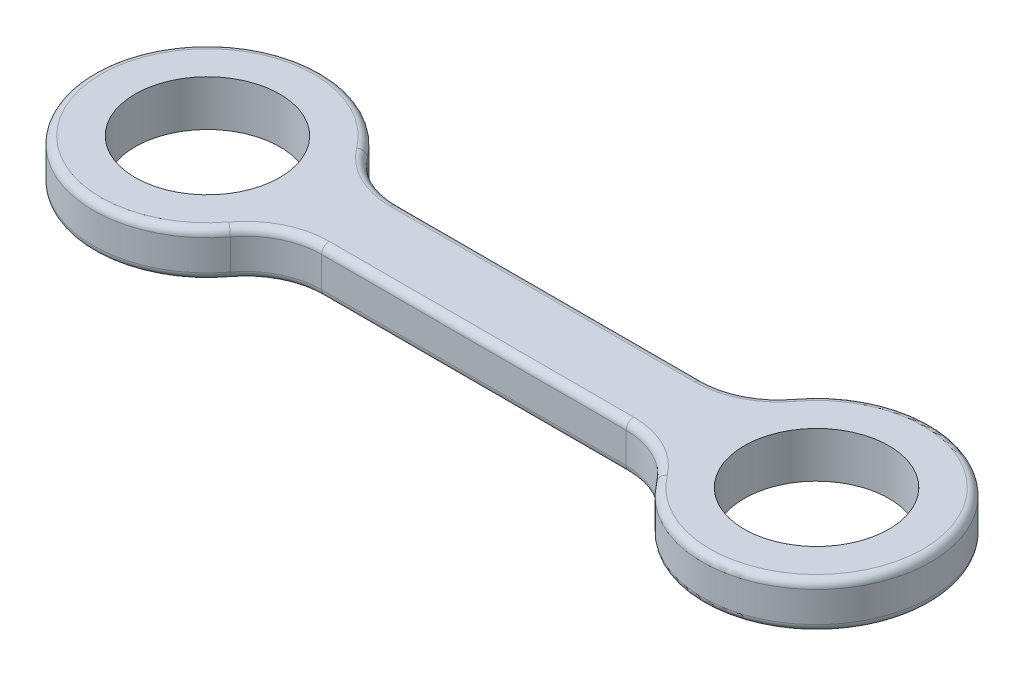
ISO-10303-21;
HEADER;
FILE_DESCRIPTION(('STEP AP214'),'2;1');
FILE_NAME('part.step','',(''),(''),'','','');
FILE_SCHEMA(('AUTOMOTIVE_DESIGN { 1 0 10303 214 1 1 1 1 }'));
ENDSEC;
DATA;
#1=APPLICATION_CONTEXT('core data for automotive mechanical design processes');
#2=APPLICATION_PROTOCOL_DEFINITION('international standard','automotive_design',2000,#1);
#3=PRODUCT_CONTEXT('',#1,'mechanical');
#4=PRODUCT('Part','Part','',(#3));
#5=PRODUCT_RELATED_PRODUCT_CATEGORY('part','',(#4));
#6=PRODUCT_DEFINITION_FORMATION('','',#4);
#7=PRODUCT_DEFINITION_CONTEXT('part definition',#1,'design');
#8=PRODUCT_DEFINITION('design','',#6,#7);
#9=PRODUCT_DEFINITION_SHAPE('','',#8);
#10=(LENGTH_UNIT() NAMED_UNIT(*) SI_UNIT(.MILLI.,.METRE.));
#11=(NAMED_UNIT(*) PLANE_ANGLE_UNIT() SI_UNIT($,.RADIAN.));
#12=(NAMED_UNIT(*) SI_UNIT($,.STERADIAN.) SOLID_ANGLE_UNIT());
#13=UNCERTAINTY_MEASURE_WITH_UNIT(LENGTH_MEASURE(1.E-05),#10,'distance_accuracy_value','');
#14=(GEOMETRIC_REPRESENTATION_CONTEXT(3) GLOBAL_UNCERTAINTY_ASSIGNED_CONTEXT((#13)) GLOBAL_UNIT_ASSIGNED_CONTEXT((#10,
#11,#12)) REPRESENTATION_CONTEXT('',''));
#15=CARTESIAN_POINT('',(0.,0.,0.));
#16=DIRECTION('',(0.,0.,1.));
#17=DIRECTION('',(1.,0.,0.));
#18=AXIS2_PLACEMENT_3D('',#15,#16,#17);
#19=CARTESIAN_POINT('',(11.9540229885058,6.,-15.));
#20=DIRECTION('',(0.,-1.,0.));
#21=DIRECTION('',(0.,0.,-1.));
#22=AXIS2_PLACEMENT_3D('',#19,#20,#21);
#23=PLANE('',#22);
#24=CARTESIAN_POINT('',(-48.0459770114942,6.,0.));
#25=DIRECTION('',(0.,-1.,0.));
#26=DIRECTION('',(0.,0.,-1.));
#27=AXIS2_PLACEMENT_3D('',#24,#25,#26);
#28=CIRCLE('',#27,14.);
#29=CARTESIAN_POINT('',(-36.8459770114942,6.,-8.4));
#30=VERTEX_POINT('',#29);
#31=CARTESIAN_POINT('',(-36.8459770114942,6.,8.4));
#32=VERTEX_POINT('',#31);
#33=EDGE_CURVE('E57',#30,#32,#28,.F.);
#34=ORIENTED_EDGE('',*,*,#33,.T.);
#35=CARTESIAN_POINT('',(-28.0459770114942,6.,15.));
#36=DIRECTION('',(0.,-1.,0.));
#37=DIRECTION('',(0.,0.,-1.));
#38=AXIS2_PLACEMENT_3D('',#35,#36,#37);
#39=CIRCLE('',#38,11.);
#40=CARTESIAN_POINT('',(-28.0459770114942,6.,4.));
#41=VERTEX_POINT('',#40);
#42=EDGE_CURVE('E159',#32,#41,#39,.T.);
#43=ORIENTED_EDGE('',*,*,#42,.T.);
#44=DIRECTION('',(1.,0.,0.));
#45=VECTOR('',#44,1.);
#46=CARTESIAN_POINT('',(11.9540229885058,6.,4.));
#47=LINE('',#46,#45);
#48=CARTESIAN_POINT('',(11.9540229885058,6.,4.));
#49=VERTEX_POINT('',#48);
#50=EDGE_CURVE('E267',#41,#49,#47,.T.);
#51=ORIENTED_EDGE('',*,*,#50,.T.);
#52=CARTESIAN_POINT('',(11.9540229885058,6.,15.));
#53=DIRECTION('',(0.,-1.,0.));
#54=DIRECTION('',(0.,0.,-1.));
#55=AXIS2_PLACEMENT_3D('',#52,#53,#54);
#56=CIRCLE('',#55,11.);
#57=CARTESIAN_POINT('',(20.7540229885058,6.,8.4));
#58=VERTEX_POINT('',#57);
#59=EDGE_CURVE('E270',#49,#58,#56,.T.);
#60=ORIENTED_EDGE('',*,*,#59,.T.);
#61=CARTESIAN_POINT('',(31.9540229885058,6.,0.));
#62=DIRECTION('',(0.,-1.,0.));
#63=DIRECTION('',(0.,0.,-1.));
#64=AXIS2_PLACEMENT_3D('',#61,#62,#63);
#65=CIRCLE('',#64,14.);
#66=CARTESIAN_POINT('',(20.7540229885058,6.,-8.4));
#67=VERTEX_POINT('',#66);
#68=EDGE_CURVE('E273',#58,#67,#65,.F.);
#69=ORIENTED_EDGE('',*,*,#68,.T.);
#70=CARTESIAN_POINT('',(11.9540229885058,6.,-15.));
#71=DIRECTION('',(0.,-1.,0.));
#72=DIRECTION('',(0.,0.,-1.));
#73=AXIS2_PLACEMENT_3D('',#70,#71,#72);
#74=CIRCLE('',#73,11.);
#75=CARTESIAN_POINT('',(11.9540229885058,6.,-4.));
#76=VERTEX_POINT('',#75);
#77=EDGE_CURVE('E276',#67,#76,#74,.T.);
#78=ORIENTED_EDGE('',*,*,#77,.T.);
#79=DIRECTION('',(-1.,0.,0.));
#80=VECTOR('',#79,1.);
#81=CARTESIAN_POINT('',(11.9540229885058,6.,-4.));
#82=LINE('',#81,#80);
#83=CARTESIAN_POINT('',(-28.0459770114942,6.,-4.));
#84=VERTEX_POINT('',#83);
#85=EDGE_CURVE('E279',#76,#84,#82,.T.);
#86=ORIENTED_EDGE('',*,*,#85,.T.);
#87=CARTESIAN_POINT('',(-28.0459770114942,6.,-15.));
#88=DIRECTION('',(0.,-1.,0.));
#89=DIRECTION('',(0.,0.,-1.));
#90=AXIS2_PLACEMENT_3D('',#87,#88,#89);
#91=CIRCLE('',#90,11.);
#92=EDGE_CURVE('E62',#84,#30,#91,.T.);
#93=ORIENTED_EDGE('',*,*,#92,.T.);
#94=EDGE_LOOP('',(#34,#43,#51,#60,#69,#78,#86,#93));
#95=FACE_BOUND('',#94,.T.);
#96=CARTESIAN_POINT('',(-48.0459770114942,6.,0.));
#97=DIRECTION('',(0.,1.,0.));
#98=DIRECTION('',(0.,0.,1.));
#99=AXIS2_PLACEMENT_3D('',#96,#97,#98);
#100=CIRCLE('',#99,9.5);
#101=CARTESIAN_POINT('',(-48.0459770114942,6.,9.5));
#102=VERTEX_POINT('',#101);
#103=EDGE_CURVE('E367',#102,#102,#100,.T.);
#104=ORIENTED_EDGE('',*,*,#103,.F.);
#105=EDGE_LOOP('',(#104));
#106=FACE_BOUND('',#105,.T.);
#107=CARTESIAN_POINT('',(31.9540229885058,6.,0.));
#108=DIRECTION('',(0.,1.,0.));
#109=DIRECTION('',(0.,0.,1.));
#110=AXIS2_PLACEMENT_3D('',#107,#108,#109);
#111=CIRCLE('',#110,9.50000000000001);
#112=CARTESIAN_POINT('',(31.9540229885058,6.,9.50000000000001));
#113=VERTEX_POINT('',#112);
#114=EDGE_CURVE('E443',#113,#113,#111,.T.);
#115=ORIENTED_EDGE('',*,*,#114,.F.);
#116=EDGE_LOOP('',(#115));
#117=FACE_BOUND('',#116,.T.);
#118=ADVANCED_FACE('F39',(#95,#106,#117),#23,.F.);
#119=CARTESIAN_POINT('',(11.9540229885058,0.,-15.));
#120=DIRECTION('',(0.,-1.,0.));
#121=DIRECTION('',(0.,0.,-1.));
#122=AXIS2_PLACEMENT_3D('',#119,#120,#121);
#123=PLANE('',#122);
#124=CARTESIAN_POINT('',(-28.0459770114942,0.,15.));
#125=DIRECTION('',(0.,-1.,0.));
#126=DIRECTION('',(0.,0.,-1.));
#127=AXIS2_PLACEMENT_3D('',#124,#125,#126);
#128=CIRCLE('',#127,11.);
#129=CARTESIAN_POINT('',(-28.0459770114942,0.,4.));
#130=VERTEX_POINT('',#129);
#131=CARTESIAN_POINT('',(-36.8459770114942,0.,8.4));
#132=VERTEX_POINT('',#131);
#133=EDGE_CURVE('E206',#130,#132,#128,.F.);
#134=ORIENTED_EDGE('',*,*,#133,.T.);
#135=CARTESIAN_POINT('',(-48.0459770114942,0.,0.));
#136=DIRECTION('',(0.,-1.,0.));
#137=DIRECTION('',(0.,0.,-1.));
#138=AXIS2_PLACEMENT_3D('',#135,#136,#137);
#139=CIRCLE('',#138,14.);
#140=CARTESIAN_POINT('',(-36.8459770114942,0.,-8.39999999999999));
#141=VERTEX_POINT('',#140);
#142=EDGE_CURVE('E227',#132,#141,#139,.T.);
#143=ORIENTED_EDGE('',*,*,#142,.T.);
#144=CARTESIAN_POINT('',(-28.0459770114942,0.,-15.));
#145=DIRECTION('',(0.,-1.,0.));
#146=DIRECTION('',(0.,0.,-1.));
#147=AXIS2_PLACEMENT_3D('',#144,#145,#146);
#148=CIRCLE('',#147,11.);
#149=CARTESIAN_POINT('',(-28.0459770114942,0.,-4.));
#150=VERTEX_POINT('',#149);
#151=EDGE_CURVE('E224',#141,#150,#148,.F.);
#152=ORIENTED_EDGE('',*,*,#151,.T.);
#153=DIRECTION('',(-1.,0.,0.));
#154=VECTOR('',#153,1.);
#155=CARTESIAN_POINT('',(11.9540229885058,0.,-4.));
#156=LINE('',#155,#154);
#157=CARTESIAN_POINT('',(11.9540229885058,0.,-4.));
#158=VERTEX_POINT('',#157);
#159=EDGE_CURVE('E221',#150,#158,#156,.F.);
#160=ORIENTED_EDGE('',*,*,#159,.T.);
#161=CARTESIAN_POINT('',(11.9540229885058,0.,-15.));
#162=DIRECTION('',(0.,-1.,0.));
#163=DIRECTION('',(0.,0.,-1.));
#164=AXIS2_PLACEMENT_3D('',#161,#162,#163);
#165=CIRCLE('',#164,11.);
#166=CARTESIAN_POINT('',(20.7540229885058,0.,-8.4));
#167=VERTEX_POINT('',#166);
#168=EDGE_CURVE('E218',#158,#167,#165,.F.);
#169=ORIENTED_EDGE('',*,*,#168,.T.);
#170=CARTESIAN_POINT('',(31.9540229885058,0.,0.));
#171=DIRECTION('',(0.,-1.,0.));
#172=DIRECTION('',(0.,0.,-1.));
#173=AXIS2_PLACEMENT_3D('',#170,#171,#172);
#174=CIRCLE('',#173,14.);
#175=CARTESIAN_POINT('',(20.7540229885058,0.,8.4));
#176=VERTEX_POINT('',#175);
#177=EDGE_CURVE('E215',#167,#176,#174,.T.);
#178=ORIENTED_EDGE('',*,*,#177,.T.);
#179=CARTESIAN_POINT('',(11.9540229885058,0.,15.));
#180=DIRECTION('',(0.,-1.,0.));
#181=DIRECTION('',(0.,0.,-1.));
#182=AXIS2_PLACEMENT_3D('',#179,#180,#181);
#183=CIRCLE('',#182,11.);
#184=CARTESIAN_POINT('',(11.9540229885058,0.,4.));
#185=VERTEX_POINT('',#184);
#186=EDGE_CURVE('E212',#176,#185,#183,.F.);
#187=ORIENTED_EDGE('',*,*,#186,.T.);
#188=DIRECTION('',(1.,0.,0.));
#189=VECTOR('',#188,1.);
#190=CARTESIAN_POINT('',(-28.0459770114942,0.,4.));
#191=LINE('',#190,#189);
#192=EDGE_CURVE('E209',#185,#130,#191,.F.);
#193=ORIENTED_EDGE('',*,*,#192,.T.);
#194=EDGE_LOOP('',(#134,#143,#152,#160,#169,#178,#187,#193));
#195=FACE_BOUND('',#194,.T.);
#196=CARTESIAN_POINT('',(-48.0459770114942,0.,0.));
#197=DIRECTION('',(0.,1.,0.));
#198=DIRECTION('',(0.,0.,1.));
#199=AXIS2_PLACEMENT_3D('',#196,#197,#198);
#200=CIRCLE('',#199,9.5);
#201=CARTESIAN_POINT('',(-48.0459770114942,0.,9.5));
#202=VERTEX_POINT('',#201);
#203=EDGE_CURVE('E373',#202,#202,#200,.T.);
#204=ORIENTED_EDGE('',*,*,#203,.T.);
#205=EDGE_LOOP('',(#204));
#206=FACE_BOUND('',#205,.T.);
#207=CARTESIAN_POINT('',(31.9540229885058,0.,0.));
#208=DIRECTION('',(0.,1.,0.));
#209=DIRECTION('',(0.,0.,1.));
#210=AXIS2_PLACEMENT_3D('',#207,#208,#209);
#211=CIRCLE('',#210,9.50000000000001);
#212=CARTESIAN_POINT('',(31.9540229885058,0.,9.50000000000001));
#213=VERTEX_POINT('',#212);
#214=EDGE_CURVE('E320',#213,#213,#211,.T.);
#215=ORIENTED_EDGE('',*,*,#214,.T.);
#216=EDGE_LOOP('',(#215));
#217=FACE_BOUND('',#216,.T.);
#218=ADVANCED_FACE('F397',(#195,#206,#217),#123,.T.);
#219=CARTESIAN_POINT('',(11.9540229885058,6.,-15.));
#220=DIRECTION('',(0.,-1.,0.));
#221=DIRECTION('',(0.,0.,-1.));
#222=AXIS2_PLACEMENT_3D('',#219,#220,#221);
#223=CYLINDRICAL_SURFACE('',#222,10.);
#224=DIRECTION('',(0.,-1.,0.));
#225=VECTOR('',#224,1.);
#226=CARTESIAN_POINT('',(19.9540229885058,6.,-9.));
#227=LINE('',#226,#225);
#228=CARTESIAN_POINT('',(19.9540229885058,5.,-9.));
#229=VERTEX_POINT('',#228);
#230=CARTESIAN_POINT('',(19.9540229885058,1.,-9.));
#231=VERTEX_POINT('',#230);
#232=EDGE_CURVE('E358',#229,#231,#227,.T.);
#233=ORIENTED_EDGE('',*,*,#232,.T.);
#234=CARTESIAN_POINT('',(11.9540229885058,1.,-15.));
#235=DIRECTION('',(0.,-1.,0.));
#236=DIRECTION('',(0.,0.,-1.));
#237=AXIS2_PLACEMENT_3D('',#234,#235,#236);
#238=CIRCLE('',#237,10.);
#239=CARTESIAN_POINT('',(11.9540229885058,1.,-5.));
#240=VERTEX_POINT('',#239);
#241=EDGE_CURVE('E246',#231,#240,#238,.T.);
#242=ORIENTED_EDGE('',*,*,#241,.T.);
#243=DIRECTION('',(0.,-1.,0.));
#244=VECTOR('',#243,1.);
#245=CARTESIAN_POINT('',(11.9540229885058,6.,-5.));
#246=LINE('',#245,#244);
#247=CARTESIAN_POINT('',(11.9540229885058,5.,-5.));
#248=VERTEX_POINT('',#247);
#249=EDGE_CURVE('E175',#248,#240,#246,.T.);
#250=ORIENTED_EDGE('',*,*,#249,.F.);
#251=CARTESIAN_POINT('',(11.9540229885058,5.,-15.));
#252=DIRECTION('',(0.,-1.,0.));
#253=DIRECTION('',(0.,0.,-1.));
#254=AXIS2_PLACEMENT_3D('',#251,#252,#253);
#255=CIRCLE('',#254,10.);
#256=EDGE_CURVE('E243',#248,#229,#255,.F.);
#257=ORIENTED_EDGE('',*,*,#256,.T.);
#258=EDGE_LOOP('',(#233,#242,#250,#257));
#259=FACE_BOUND('',#258,.T.);
#260=ADVANCED_FACE('F357',(#259),#223,.F.);
#261=CARTESIAN_POINT('',(-28.0459770114942,6.,-5.));
#262=DIRECTION('',(0.,0.,1.));
#263=DIRECTION('',(1.,0.,0.));
#264=AXIS2_PLACEMENT_3D('',#261,#262,#263);
#265=PLANE('',#264);
#266=ORIENTED_EDGE('',*,*,#249,.T.);
#267=DIRECTION('',(-1.,0.,0.));
#268=VECTOR('',#267,1.);
#269=CARTESIAN_POINT('',(-28.0459770114942,1.,-5.));
#270=LINE('',#269,#268);
#271=CARTESIAN_POINT('',(-28.0459770114942,1.,-4.99999999999999));
#272=VERTEX_POINT('',#271);
#273=EDGE_CURVE('E240',#240,#272,#270,.T.);
#274=ORIENTED_EDGE('',*,*,#273,.T.);
#275=DIRECTION('',(0.,-1.,0.));
#276=VECTOR('',#275,1.);
#277=CARTESIAN_POINT('',(-28.0459770114942,6.,-4.99999999999999));
#278=LINE('',#277,#276);
#279=CARTESIAN_POINT('',(-28.0459770114942,5.,-4.99999999999999));
#280=VERTEX_POINT('',#279);
#281=EDGE_CURVE('E192',#280,#272,#278,.T.);
#282=ORIENTED_EDGE('',*,*,#281,.F.);
#283=DIRECTION('',(-1.,0.,0.));
#284=VECTOR('',#283,1.);
#285=CARTESIAN_POINT('',(-28.0459770114942,5.,-5.));
#286=LINE('',#285,#284);
#287=EDGE_CURVE('E237',#280,#248,#286,.F.);
#288=ORIENTED_EDGE('',*,*,#287,.T.);
#289=EDGE_LOOP('',(#266,#274,#282,#288));
#290=FACE_BOUND('',#289,.T.);
#291=ADVANCED_FACE('F410',(#290),#265,.F.);
#292=CARTESIAN_POINT('',(-28.0459770114942,6.,-15.));
#293=DIRECTION('',(0.,-1.,0.));
#294=DIRECTION('',(0.,0.,-1.));
#295=AXIS2_PLACEMENT_3D('',#292,#293,#294);
#296=CYLINDRICAL_SURFACE('',#295,10.);
#297=ORIENTED_EDGE('',*,*,#281,.T.);
#298=CARTESIAN_POINT('',(-28.0459770114942,1.,-15.));
#299=DIRECTION('',(0.,-1.,0.));
#300=DIRECTION('',(0.,0.,-1.));
#301=AXIS2_PLACEMENT_3D('',#298,#299,#300);
#302=CIRCLE('',#301,10.);
#303=CARTESIAN_POINT('',(-36.0459770114942,1.,-9.));
#304=VERTEX_POINT('',#303);
#305=EDGE_CURVE('E234',#272,#304,#302,.T.);
#306=ORIENTED_EDGE('',*,*,#305,.T.);
#307=DIRECTION('',(0.,-1.,0.));
#308=VECTOR('',#307,1.);
#309=CARTESIAN_POINT('',(-36.0459770114942,6.,-9.));
#310=LINE('',#309,#308);
#311=CARTESIAN_POINT('',(-36.0459770114942,5.,-9.));
#312=VERTEX_POINT('',#311);
#313=EDGE_CURVE('E188',#312,#304,#310,.T.);
#314=ORIENTED_EDGE('',*,*,#313,.F.);
#315=CARTESIAN_POINT('',(-28.0459770114942,5.,-15.));
#316=DIRECTION('',(0.,-1.,0.));
#317=DIRECTION('',(0.,0.,-1.));
#318=AXIS2_PLACEMENT_3D('',#315,#316,#317);
#319=CIRCLE('',#318,10.);
#320=EDGE_CURVE('E231',#312,#280,#319,.F.);
#321=ORIENTED_EDGE('',*,*,#320,.T.);
#322=EDGE_LOOP('',(#297,#306,#314,#321));
#323=FACE_BOUND('',#322,.T.);
#324=ADVANCED_FACE('F414',(#323),#296,.F.);
#325=CARTESIAN_POINT('',(-48.0459770114942,6.,0.));
#326=DIRECTION('',(0.,-1.,0.));
#327=DIRECTION('',(0.,0.,-1.));
#328=AXIS2_PLACEMENT_3D('',#325,#326,#327);
#329=CYLINDRICAL_SURFACE('',#328,15.);
#330=ORIENTED_EDGE('',*,*,#313,.T.);
#331=CARTESIAN_POINT('',(-48.0459770114942,1.,0.));
#332=DIRECTION('',(0.,-1.,0.));
#333=DIRECTION('',(0.,0.,-1.));
#334=AXIS2_PLACEMENT_3D('',#331,#332,#333);
#335=CIRCLE('',#334,15.);
#336=CARTESIAN_POINT('',(-36.0459770114942,1.,9.));
#337=VERTEX_POINT('',#336);
#338=EDGE_CURVE('E174',#304,#337,#335,.F.);
#339=ORIENTED_EDGE('',*,*,#338,.T.);
#340=DIRECTION('',(0.,-1.,0.));
#341=VECTOR('',#340,1.);
#342=CARTESIAN_POINT('',(-36.0459770114942,6.,9.));
#343=LINE('',#342,#341);
#344=CARTESIAN_POINT('',(-36.0459770114942,5.,9.));
#345=VERTEX_POINT('',#344);
#346=EDGE_CURVE('E181',#345,#337,#343,.T.);
#347=ORIENTED_EDGE('',*,*,#346,.F.);
#348=CARTESIAN_POINT('',(-48.0459770114942,5.,0.));
#349=DIRECTION('',(0.,-1.,0.));
#350=DIRECTION('',(0.,0.,-1.));
#351=AXIS2_PLACEMENT_3D('',#348,#349,#350);
#352=CIRCLE('',#351,15.);
#353=EDGE_CURVE('E166',#345,#312,#352,.T.);
#354=ORIENTED_EDGE('',*,*,#353,.T.);
#355=EDGE_LOOP('',(#330,#339,#347,#354));
#356=FACE_BOUND('',#355,.T.);
#357=ADVANCED_FACE('F185',(#356),#329,.T.);
#358=CARTESIAN_POINT('',(-28.0459770114942,6.,15.));
#359=DIRECTION('',(0.,-1.,0.));
#360=DIRECTION('',(0.,0.,-1.));
#361=AXIS2_PLACEMENT_3D('',#358,#359,#360);
#362=CYLINDRICAL_SURFACE('',#361,10.);
#363=DIRECTION('',(0.,-1.,0.));
#364=VECTOR('',#363,1.);
#365=CARTESIAN_POINT('',(-28.0459770114942,6.,5.));
#366=LINE('',#365,#364);
#367=CARTESIAN_POINT('',(-28.0459770114942,5.,5.));
#368=VERTEX_POINT('',#367);
#369=CARTESIAN_POINT('',(-28.0459770114942,1.,5.));
#370=VERTEX_POINT('',#369);
#371=EDGE_CURVE('E183',#368,#370,#366,.T.);
#372=ORIENTED_EDGE('',*,*,#371,.F.);
#373=CARTESIAN_POINT('',(-28.0459770114942,5.,15.));
#374=DIRECTION('',(0.,-1.,0.));
#375=DIRECTION('',(0.,0.,-1.));
#376=AXIS2_PLACEMENT_3D('',#373,#374,#375);
#377=CIRCLE('',#376,10.);
#378=EDGE_CURVE('E11',#368,#345,#377,.F.);
#379=ORIENTED_EDGE('',*,*,#378,.T.);
#380=ORIENTED_EDGE('',*,*,#346,.T.);
#381=CARTESIAN_POINT('',(-28.0459770114942,1.,15.));
#382=DIRECTION('',(0.,-1.,0.));
#383=DIRECTION('',(0.,0.,-1.));
#384=AXIS2_PLACEMENT_3D('',#381,#382,#383);
#385=CIRCLE('',#384,10.);
#386=EDGE_CURVE('E49',#337,#370,#385,.T.);
#387=ORIENTED_EDGE('',*,*,#386,.T.);
#388=EDGE_LOOP('',(#372,#379,#380,#387));
#389=FACE_BOUND('',#388,.T.);
#390=ADVANCED_FACE('F180',(#389),#362,.F.);
#391=CARTESIAN_POINT('',(-28.0459770114942,6.,5.));
#392=DIRECTION('',(0.,0.,-1.));
#393=DIRECTION('',(-1.,0.,0.));
#394=AXIS2_PLACEMENT_3D('',#391,#392,#393);
#395=PLANE('',#394);
#396=ORIENTED_EDGE('',*,*,#371,.T.);
#397=DIRECTION('',(1.,0.,0.));
#398=VECTOR('',#397,1.);
#399=CARTESIAN_POINT('',(11.9540229885058,1.,5.));
#400=LINE('',#399,#398);
#401=CARTESIAN_POINT('',(11.9540229885058,1.,5.));
#402=VERTEX_POINT('',#401);
#403=EDGE_CURVE('E264',#370,#402,#400,.T.);
#404=ORIENTED_EDGE('',*,*,#403,.T.);
#405=DIRECTION('',(0.,-1.,0.));
#406=VECTOR('',#405,1.);
#407=CARTESIAN_POINT('',(11.9540229885058,6.,5.));
#408=LINE('',#407,#406);
#409=CARTESIAN_POINT('',(11.9540229885058,5.,5.));
#410=VERTEX_POINT('',#409);
#411=EDGE_CURVE('E194',#410,#402,#408,.T.);
#412=ORIENTED_EDGE('',*,*,#411,.F.);
#413=DIRECTION('',(1.,0.,0.));
#414=VECTOR('',#413,1.);
#415=CARTESIAN_POINT('',(-28.0459770114942,5.,5.));
#416=LINE('',#415,#414);
#417=EDGE_CURVE('E261',#410,#368,#416,.F.);
#418=ORIENTED_EDGE('',*,*,#417,.T.);
#419=EDGE_LOOP('',(#396,#404,#412,#418));
#420=FACE_BOUND('',#419,.T.);
#421=ADVANCED_FACE('F430',(#420),#395,.F.);
#422=CARTESIAN_POINT('',(11.9540229885058,6.,15.));
#423=DIRECTION('',(0.,-1.,0.));
#424=DIRECTION('',(0.,0.,-1.));
#425=AXIS2_PLACEMENT_3D('',#422,#423,#424);
#426=CYLINDRICAL_SURFACE('',#425,10.);
#427=ORIENTED_EDGE('',*,*,#411,.T.);
#428=CARTESIAN_POINT('',(11.9540229885058,1.,15.));
#429=DIRECTION('',(0.,-1.,0.));
#430=DIRECTION('',(0.,0.,-1.));
#431=AXIS2_PLACEMENT_3D('',#428,#429,#430);
#432=CIRCLE('',#431,10.);
#433=CARTESIAN_POINT('',(19.9540229885058,1.,9.));
#434=VERTEX_POINT('',#433);
#435=EDGE_CURVE('E258',#402,#434,#432,.T.);
#436=ORIENTED_EDGE('',*,*,#435,.T.);
#437=DIRECTION('',(0.,-1.,0.));
#438=VECTOR('',#437,1.);
#439=CARTESIAN_POINT('',(19.9540229885058,6.,9.));
#440=LINE('',#439,#438);
#441=CARTESIAN_POINT('',(19.9540229885058,5.,9.));
#442=VERTEX_POINT('',#441);
#443=EDGE_CURVE('E366',#442,#434,#440,.T.);
#444=ORIENTED_EDGE('',*,*,#443,.F.);
#445=CARTESIAN_POINT('',(11.9540229885058,5.,15.));
#446=DIRECTION('',(0.,-1.,0.));
#447=DIRECTION('',(0.,0.,-1.));
#448=AXIS2_PLACEMENT_3D('',#445,#446,#447);
#449=CIRCLE('',#448,10.);
#450=EDGE_CURVE('E255',#442,#410,#449,.F.);
#451=ORIENTED_EDGE('',*,*,#450,.T.);
#452=EDGE_LOOP('',(#427,#436,#444,#451));
#453=FACE_BOUND('',#452,.T.);
#454=ADVANCED_FACE('F381',(#453),#426,.F.);
#455=CARTESIAN_POINT('',(31.9540229885058,6.,0.));
#456=DIRECTION('',(0.,-1.,0.));
#457=DIRECTION('',(0.,0.,-1.));
#458=AXIS2_PLACEMENT_3D('',#455,#456,#457);
#459=CYLINDRICAL_SURFACE('',#458,15.);
#460=ORIENTED_EDGE('',*,*,#443,.T.);
#461=CARTESIAN_POINT('',(31.9540229885058,1.,0.));
#462=DIRECTION('',(0.,-1.,0.));
#463=DIRECTION('',(0.,0.,-1.));
#464=AXIS2_PLACEMENT_3D('',#461,#462,#463);
#465=CIRCLE('',#464,15.);
#466=EDGE_CURVE('E252',#434,#231,#465,.F.);
#467=ORIENTED_EDGE('',*,*,#466,.T.);
#468=ORIENTED_EDGE('',*,*,#232,.F.);
#469=CARTESIAN_POINT('',(31.9540229885058,5.,0.));
#470=DIRECTION('',(0.,-1.,0.));
#471=DIRECTION('',(0.,0.,-1.));
#472=AXIS2_PLACEMENT_3D('',#469,#470,#471);
#473=CIRCLE('',#472,15.);
#474=EDGE_CURVE('E249',#229,#442,#473,.T.);
#475=ORIENTED_EDGE('',*,*,#474,.T.);
#476=EDGE_LOOP('',(#460,#467,#468,#475));
#477=FACE_BOUND('',#476,.T.);
#478=ADVANCED_FACE('F362',(#477),#459,.T.);
#479=CARTESIAN_POINT('',(-48.0459770114942,6.,0.));
#480=DIRECTION('',(0.,-1.,0.));
#481=DIRECTION('',(0.,0.,-1.));
#482=AXIS2_PLACEMENT_3D('',#479,#480,#481);
#483=CYLINDRICAL_SURFACE('',#482,9.5);
#484=ORIENTED_EDGE('',*,*,#103,.T.);
#485=EDGE_LOOP('',(#484));
#486=FACE_BOUND('',#485,.T.);
#487=ORIENTED_EDGE('',*,*,#203,.F.);
#488=EDGE_LOOP('',(#487));
#489=FACE_BOUND('',#488,.T.);
#490=ADVANCED_FACE('F457',(#486,#489),#483,.F.);
#491=CARTESIAN_POINT('',(31.9540229885058,6.,0.));
#492=DIRECTION('',(0.,-1.,0.));
#493=DIRECTION('',(0.,0.,-1.));
#494=AXIS2_PLACEMENT_3D('',#491,#492,#493);
#495=CYLINDRICAL_SURFACE('',#494,9.50000000000001);
#496=ORIENTED_EDGE('',*,*,#114,.T.);
#497=EDGE_LOOP('',(#496));
#498=FACE_BOUND('',#497,.T.);
#499=ORIENTED_EDGE('',*,*,#214,.F.);
#500=EDGE_LOOP('',(#499));
#501=FACE_BOUND('',#500,.T.);
#502=ADVANCED_FACE('F455',(#498,#501),#495,.F.);
#503=CARTESIAN_POINT('',(31.9540229885058,1.,0.));
#504=DIRECTION('',(0.,-1.,0.));
#505=DIRECTION('',(0.,0.,-1.));
#506=AXIS2_PLACEMENT_3D('',#503,#504,#505);
#507=TOROIDAL_SURFACE('',#506,14.,1.);
#508=CARTESIAN_POINT('',(20.7540229885058,1.,8.4));
#509=DIRECTION('',(-0.600000000000001,0.,-0.799999999999999));
#510=DIRECTION('',(-0.8,0.,0.600000000000001));
#511=AXIS2_PLACEMENT_3D('',#508,#509,#510);
#512=CIRCLE('',#511,1.);
#513=EDGE_CURVE('E312',#176,#434,#512,.T.);
#514=ORIENTED_EDGE('',*,*,#513,.F.);
#515=ORIENTED_EDGE('',*,*,#177,.F.);
#516=CARTESIAN_POINT('',(20.7540229885058,1.,-8.4));
#517=DIRECTION('',(-0.600000000000001,0.,0.799999999999999));
#518=DIRECTION('',(0.8,0.,0.600000000000001));
#519=AXIS2_PLACEMENT_3D('',#516,#517,#518);
#520=CIRCLE('',#519,1.);
#521=EDGE_CURVE('E316',#231,#167,#520,.T.);
#522=ORIENTED_EDGE('',*,*,#521,.F.);
#523=ORIENTED_EDGE('',*,*,#466,.F.);
#524=EDGE_LOOP('',(#514,#515,#522,#523));
#525=FACE_BOUND('',#524,.T.);
#526=ADVANCED_FACE('F403',(#525),#507,.T.);
#527=CARTESIAN_POINT('',(11.9540229885058,1.,-15.));
#528=DIRECTION('',(0.,-1.,0.));
#529=DIRECTION('',(0.,0.,-1.));
#530=AXIS2_PLACEMENT_3D('',#527,#528,#529);
#531=TOROIDAL_SURFACE('',#530,11.,1.);
#532=ORIENTED_EDGE('',*,*,#521,.T.);
#533=ORIENTED_EDGE('',*,*,#168,.F.);
#534=CARTESIAN_POINT('',(11.9540229885058,1.,-4.));
#535=DIRECTION('',(-1.,0.,0.));
#536=DIRECTION('',(0.,0.,1.));
#537=AXIS2_PLACEMENT_3D('',#534,#535,#536);
#538=CIRCLE('',#537,1.);
#539=EDGE_CURVE('E308',#240,#158,#538,.T.);
#540=ORIENTED_EDGE('',*,*,#539,.F.);
#541=ORIENTED_EDGE('',*,*,#241,.F.);
#542=EDGE_LOOP('',(#532,#533,#540,#541));
#543=FACE_BOUND('',#542,.T.);
#544=ADVANCED_FACE('F407',(#543),#531,.T.);
#545=CARTESIAN_POINT('',(11.9540229885058,1.,15.));
#546=DIRECTION('',(0.,-1.,0.));
#547=DIRECTION('',(0.,0.,-1.));
#548=AXIS2_PLACEMENT_3D('',#545,#546,#547);
#549=TOROIDAL_SURFACE('',#548,11.,1.);
#550=ORIENTED_EDGE('',*,*,#513,.T.);
#551=ORIENTED_EDGE('',*,*,#435,.F.);
#552=CARTESIAN_POINT('',(11.9540229885058,1.,4.));
#553=DIRECTION('',(-1.,0.,0.));
#554=DIRECTION('',(0.,0.,1.));
#555=AXIS2_PLACEMENT_3D('',#552,#553,#554);
#556=CIRCLE('',#555,1.);
#557=EDGE_CURVE('E304',#185,#402,#556,.T.);
#558=ORIENTED_EDGE('',*,*,#557,.F.);
#559=ORIENTED_EDGE('',*,*,#186,.F.);
#560=EDGE_LOOP('',(#550,#551,#558,#559));
#561=FACE_BOUND('',#560,.T.);
#562=ADVANCED_FACE('F387',(#561),#549,.T.);
#563=CARTESIAN_POINT('',(-28.0459770114942,1.,-4.));
#564=DIRECTION('',(1.,0.,0.));
#565=DIRECTION('',(0.,0.,-1.));
#566=AXIS2_PLACEMENT_3D('',#563,#564,#565);
#567=CYLINDRICAL_SURFACE('',#566,1.);
#568=ORIENTED_EDGE('',*,*,#539,.T.);
#569=ORIENTED_EDGE('',*,*,#159,.F.);
#570=CARTESIAN_POINT('',(-28.0459770114942,1.,-4.));
#571=DIRECTION('',(-1.,0.,0.));
#572=DIRECTION('',(0.,0.,1.));
#573=AXIS2_PLACEMENT_3D('',#570,#571,#572);
#574=CIRCLE('',#573,1.);
#575=EDGE_CURVE('E300',#272,#150,#574,.T.);
#576=ORIENTED_EDGE('',*,*,#575,.F.);
#577=ORIENTED_EDGE('',*,*,#273,.F.);
#578=EDGE_LOOP('',(#568,#569,#576,#577));
#579=FACE_BOUND('',#578,.T.);
#580=ADVANCED_FACE('F419',(#579),#567,.T.);
#581=CARTESIAN_POINT('',(-28.0459770114942,1.,4.));
#582=DIRECTION('',(-1.,0.,0.));
#583=DIRECTION('',(0.,0.,1.));
#584=AXIS2_PLACEMENT_3D('',#581,#582,#583);
#585=CYLINDRICAL_SURFACE('',#584,1.);
#586=ORIENTED_EDGE('',*,*,#557,.T.);
#587=ORIENTED_EDGE('',*,*,#403,.F.);
#588=CARTESIAN_POINT('',(-28.0459770114942,1.,4.));
#589=DIRECTION('',(-1.,0.,0.));
#590=DIRECTION('',(0.,0.,1.));
#591=AXIS2_PLACEMENT_3D('',#588,#589,#590);
#592=CIRCLE('',#591,1.);
#593=EDGE_CURVE('E296',#130,#370,#592,.T.);
#594=ORIENTED_EDGE('',*,*,#593,.F.);
#595=ORIENTED_EDGE('',*,*,#192,.F.);
#596=EDGE_LOOP('',(#586,#587,#594,#595));
#597=FACE_BOUND('',#596,.T.);
#598=ADVANCED_FACE('F393',(#597),#585,.T.);
#599=CARTESIAN_POINT('',(-28.0459770114942,1.,-15.));
#600=DIRECTION('',(0.,-1.,0.));
#601=DIRECTION('',(0.,0.,-1.));
#602=AXIS2_PLACEMENT_3D('',#599,#600,#601);
#603=TOROIDAL_SURFACE('',#602,11.,1.);
#604=ORIENTED_EDGE('',*,*,#575,.T.);
#605=ORIENTED_EDGE('',*,*,#151,.F.);
#606=CARTESIAN_POINT('',(-36.8459770114942,1.,-8.39999999999999));
#607=DIRECTION('',(-0.599999999999999,0.,-0.800000000000001));
#608=DIRECTION('',(-0.800000000000001,0.,0.599999999999999));
#609=AXIS2_PLACEMENT_3D('',#606,#607,#608);
#610=CIRCLE('',#609,1.);
#611=EDGE_CURVE('E293',#304,#141,#610,.T.);
#612=ORIENTED_EDGE('',*,*,#611,.F.);
#613=ORIENTED_EDGE('',*,*,#305,.F.);
#614=EDGE_LOOP('',(#604,#605,#612,#613));
#615=FACE_BOUND('',#614,.T.);
#616=ADVANCED_FACE('F423',(#615),#603,.T.);
#617=CARTESIAN_POINT('',(-28.0459770114942,1.,15.));
#618=DIRECTION('',(0.,-1.,0.));
#619=DIRECTION('',(0.,0.,-1.));
#620=AXIS2_PLACEMENT_3D('',#617,#618,#619);
#621=TOROIDAL_SURFACE('',#620,11.,1.);
#622=ORIENTED_EDGE('',*,*,#593,.T.);
#623=ORIENTED_EDGE('',*,*,#386,.F.);
#624=CARTESIAN_POINT('',(-36.8459770114942,1.,8.4));
#625=DIRECTION('',(-0.599999999999998,0.,0.800000000000002));
#626=DIRECTION('',(0.800000000000002,0.,0.599999999999998));
#627=AXIS2_PLACEMENT_3D('',#624,#625,#626);
#628=CIRCLE('',#627,1.);
#629=EDGE_CURVE('E290',#132,#337,#628,.T.);
#630=ORIENTED_EDGE('',*,*,#629,.F.);
#631=ORIENTED_EDGE('',*,*,#133,.F.);
#632=EDGE_LOOP('',(#622,#623,#630,#631));
#633=FACE_BOUND('',#632,.T.);
#634=ADVANCED_FACE('F429',(#633),#621,.T.);
#635=CARTESIAN_POINT('',(-48.0459770114942,1.,0.));
#636=DIRECTION('',(0.,-1.,0.));
#637=DIRECTION('',(0.,0.,-1.));
#638=AXIS2_PLACEMENT_3D('',#635,#636,#637);
#639=TOROIDAL_SURFACE('',#638,14.,1.);
#640=ORIENTED_EDGE('',*,*,#611,.T.);
#641=ORIENTED_EDGE('',*,*,#142,.F.);
#642=ORIENTED_EDGE('',*,*,#629,.T.);
#643=ORIENTED_EDGE('',*,*,#338,.F.);
#644=EDGE_LOOP('',(#640,#641,#642,#643));
#645=FACE_BOUND('',#644,.T.);
#646=ADVANCED_FACE('F425',(#645),#639,.T.);
#647=CARTESIAN_POINT('',(11.9540229885058,5.,-15.));
#648=DIRECTION('',(0.,-1.,0.));
#649=DIRECTION('',(0.,0.,-1.));
#650=AXIS2_PLACEMENT_3D('',#647,#648,#649);
#651=TOROIDAL_SURFACE('',#650,11.,1.);
#652=CARTESIAN_POINT('',(20.7540229885058,5.,-8.4));
#653=DIRECTION('',(0.600000000000001,0.,-0.799999999999999));
#654=DIRECTION('',(-0.8,0.,-0.600000000000001));
#655=AXIS2_PLACEMENT_3D('',#652,#653,#654);
#656=CIRCLE('',#655,1.);
#657=EDGE_CURVE('E335',#229,#67,#656,.T.);
#658=ORIENTED_EDGE('',*,*,#657,.F.);
#659=ORIENTED_EDGE('',*,*,#256,.F.);
#660=CARTESIAN_POINT('',(11.9540229885058,5.,-4.));
#661=DIRECTION('',(-1.,0.,0.));
#662=DIRECTION('',(0.,0.,1.));
#663=AXIS2_PLACEMENT_3D('',#660,#661,#662);
#664=CIRCLE('',#663,1.);
#665=EDGE_CURVE('E43',#76,#248,#664,.T.);
#666=ORIENTED_EDGE('',*,*,#665,.F.);
#667=ORIENTED_EDGE('',*,*,#77,.F.);
#668=EDGE_LOOP('',(#658,#659,#666,#667));
#669=FACE_BOUND('',#668,.T.);
#670=ADVANCED_FACE('F41',(#669),#651,.T.);
#671=CARTESIAN_POINT('',(11.9540229885058,5.,-4.));
#672=DIRECTION('',(-1.,0.,0.));
#673=DIRECTION('',(0.,0.,1.));
#674=AXIS2_PLACEMENT_3D('',#671,#672,#673);
#675=CYLINDRICAL_SURFACE('',#674,1.);
#676=ORIENTED_EDGE('',*,*,#665,.T.);
#677=ORIENTED_EDGE('',*,*,#287,.F.);
#678=CARTESIAN_POINT('',(-28.0459770114942,5.,-4.));
#679=DIRECTION('',(-1.,0.,0.));
#680=DIRECTION('',(0.,0.,1.));
#681=AXIS2_PLACEMENT_3D('',#678,#679,#680);
#682=CIRCLE('',#681,1.);
#683=EDGE_CURVE('E332',#84,#280,#682,.T.);
#684=ORIENTED_EDGE('',*,*,#683,.F.);
#685=ORIENTED_EDGE('',*,*,#85,.F.);
#686=EDGE_LOOP('',(#676,#677,#684,#685));
#687=FACE_BOUND('',#686,.T.);
#688=ADVANCED_FACE('F348',(#687),#675,.T.);
#689=CARTESIAN_POINT('',(31.9540229885058,5.,0.));
#690=DIRECTION('',(0.,-1.,0.));
#691=DIRECTION('',(0.,0.,-1.));
#692=AXIS2_PLACEMENT_3D('',#689,#690,#691);
#693=TOROIDAL_SURFACE('',#692,14.,1.);
#694=ORIENTED_EDGE('',*,*,#657,.T.);
#695=ORIENTED_EDGE('',*,*,#68,.F.);
#696=CARTESIAN_POINT('',(20.7540229885058,5.,8.4));
#697=DIRECTION('',(-0.600000000000001,0.,-0.799999999999999));
#698=DIRECTION('',(-0.8,0.,0.600000000000001));
#699=AXIS2_PLACEMENT_3D('',#696,#697,#698);
#700=CIRCLE('',#699,1.);
#701=EDGE_CURVE('E328',#442,#58,#700,.T.);
#702=ORIENTED_EDGE('',*,*,#701,.F.);
#703=ORIENTED_EDGE('',*,*,#474,.F.);
#704=EDGE_LOOP('',(#694,#695,#702,#703));
#705=FACE_BOUND('',#704,.T.);
#706=ADVANCED_FACE('F512',(#705),#693,.T.);
#707=CARTESIAN_POINT('',(-28.0459770114942,5.,-15.));
#708=DIRECTION('',(0.,-1.,0.));
#709=DIRECTION('',(0.,0.,-1.));
#710=AXIS2_PLACEMENT_3D('',#707,#708,#709);
#711=TOROIDAL_SURFACE('',#710,11.,1.);
#712=ORIENTED_EDGE('',*,*,#683,.T.);
#713=ORIENTED_EDGE('',*,*,#320,.F.);
#714=CARTESIAN_POINT('',(-36.8459770114942,5.,-8.4));
#715=DIRECTION('',(-0.599999999999998,0.,-0.800000000000002));
#716=DIRECTION('',(-0.800000000000002,0.,0.599999999999998));
#717=AXIS2_PLACEMENT_3D('',#714,#715,#716);
#718=CIRCLE('',#717,1.);
#719=EDGE_CURVE('E168',#30,#312,#718,.T.);
#720=ORIENTED_EDGE('',*,*,#719,.F.);
#721=ORIENTED_EDGE('',*,*,#92,.F.);
#722=EDGE_LOOP('',(#712,#713,#720,#721));
#723=FACE_BOUND('',#722,.T.);
#724=ADVANCED_FACE('F508',(#723),#711,.T.);
#725=CARTESIAN_POINT('',(11.9540229885058,5.,15.));
#726=DIRECTION('',(0.,-1.,0.));
#727=DIRECTION('',(0.,0.,-1.));
#728=AXIS2_PLACEMENT_3D('',#725,#726,#727);
#729=TOROIDAL_SURFACE('',#728,11.,1.);
#730=ORIENTED_EDGE('',*,*,#701,.T.);
#731=ORIENTED_EDGE('',*,*,#59,.F.);
#732=CARTESIAN_POINT('',(11.9540229885058,5.,4.));
#733=DIRECTION('',(-1.,0.,0.));
#734=DIRECTION('',(0.,0.,1.));
#735=AXIS2_PLACEMENT_3D('',#732,#733,#734);
#736=CIRCLE('',#735,1.);
#737=EDGE_CURVE('E162',#410,#49,#736,.T.);
#738=ORIENTED_EDGE('',*,*,#737,.F.);
#739=ORIENTED_EDGE('',*,*,#450,.F.);
#740=EDGE_LOOP('',(#730,#731,#738,#739));
#741=FACE_BOUND('',#740,.T.);
#742=ADVANCED_FACE('F505',(#741),#729,.T.);
#743=CARTESIAN_POINT('',(-48.0459770114942,5.,0.));
#744=DIRECTION('',(0.,-1.,0.));
#745=DIRECTION('',(0.,0.,-1.));
#746=AXIS2_PLACEMENT_3D('',#743,#744,#745);
#747=TOROIDAL_SURFACE('',#746,14.,1.);
#748=ORIENTED_EDGE('',*,*,#719,.T.);
#749=ORIENTED_EDGE('',*,*,#353,.F.);
#750=CARTESIAN_POINT('',(-36.8459770114942,5.,8.4));
#751=DIRECTION('',(0.600000000000001,0.,-0.799999999999999));
#752=DIRECTION('',(-0.799999999999999,0.,-0.600000000000001));
#753=AXIS2_PLACEMENT_3D('',#750,#751,#752);
#754=CIRCLE('',#753,1.);
#755=EDGE_CURVE('E155',#32,#345,#754,.T.);
#756=ORIENTED_EDGE('',*,*,#755,.F.);
#757=ORIENTED_EDGE('',*,*,#33,.F.);
#758=EDGE_LOOP('',(#748,#749,#756,#757));
#759=FACE_BOUND('',#758,.T.);
#760=ADVANCED_FACE('F167',(#759),#747,.T.);
#761=CARTESIAN_POINT('',(11.9540229885058,5.,4.));
#762=DIRECTION('',(1.,0.,0.));
#763=DIRECTION('',(0.,0.,-1.));
#764=AXIS2_PLACEMENT_3D('',#761,#762,#763);
#765=CYLINDRICAL_SURFACE('',#764,1.);
#766=ORIENTED_EDGE('',*,*,#737,.T.);
#767=ORIENTED_EDGE('',*,*,#50,.F.);
#768=CARTESIAN_POINT('',(-28.0459770114942,5.,4.));
#769=DIRECTION('',(-1.,0.,0.));
#770=DIRECTION('',(0.,0.,1.));
#771=AXIS2_PLACEMENT_3D('',#768,#769,#770);
#772=CIRCLE('',#771,1.);
#773=EDGE_CURVE('E163',#368,#41,#772,.T.);
#774=ORIENTED_EDGE('',*,*,#773,.F.);
#775=ORIENTED_EDGE('',*,*,#417,.F.);
#776=EDGE_LOOP('',(#766,#767,#774,#775));
#777=FACE_BOUND('',#776,.T.);
#778=ADVANCED_FACE('F433',(#777),#765,.T.);
#779=CARTESIAN_POINT('',(-28.0459770114942,5.,15.));
#780=DIRECTION('',(0.,-1.,0.));
#781=DIRECTION('',(0.,0.,-1.));
#782=AXIS2_PLACEMENT_3D('',#779,#780,#781);
#783=TOROIDAL_SURFACE('',#782,11.,1.);
#784=ORIENTED_EDGE('',*,*,#755,.T.);
#785=ORIENTED_EDGE('',*,*,#378,.F.);
#786=ORIENTED_EDGE('',*,*,#773,.T.);
#787=ORIENTED_EDGE('',*,*,#42,.F.);
#788=EDGE_LOOP('',(#784,#785,#786,#787));
#789=FACE_BOUND('',#788,.T.);
#790=ADVANCED_FACE('F157',(#789),#783,.T.);
#791=CLOSED_SHELL('',(#118,#218,#260,#291,#324,#357,#390,#421,#454,#478,#490,#502,#526,#544,
#562,#580,#598,#616,#634,#646,#670,#688,#706,#724,#742,#760,#778,#790));
#792=MANIFOLD_SOLID_BREP('B2',#791);
#793=ADVANCED_BREP_SHAPE_REPRESENTATION('',(#18,#792),#14);
#794=SHAPE_DEFINITION_REPRESENTATION(#9,#793);
ENDSEC;
END-ISO-10303-21;
